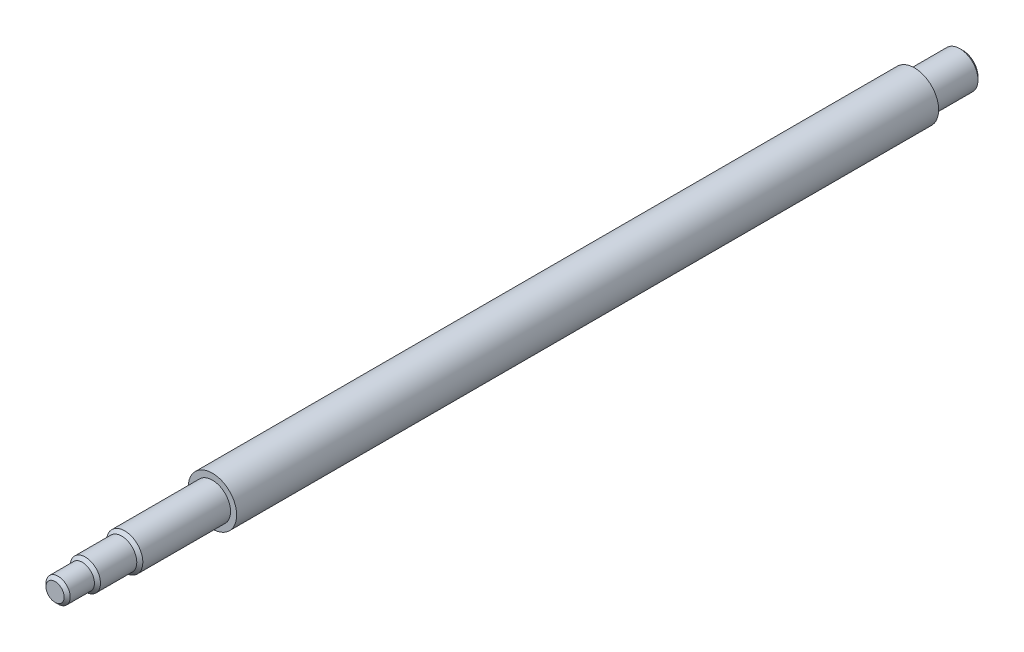
ISO-10303-21;
HEADER;
FILE_DESCRIPTION(('STEP AP214'),'2;1');
FILE_NAME('part.step','',(''),(''),'','','');
FILE_SCHEMA(('AUTOMOTIVE_DESIGN { 1 0 10303 214 1 1 1 1 }'));
ENDSEC;
DATA;
#1=APPLICATION_CONTEXT('core data for automotive mechanical design processes');
#2=APPLICATION_PROTOCOL_DEFINITION('international standard','automotive_design',2000,#1);
#3=PRODUCT_CONTEXT('',#1,'mechanical');
#4=PRODUCT('Part','Part','',(#3));
#5=PRODUCT_RELATED_PRODUCT_CATEGORY('part','',(#4));
#6=PRODUCT_DEFINITION_FORMATION('','',#4);
#7=PRODUCT_DEFINITION_CONTEXT('part definition',#1,'design');
#8=PRODUCT_DEFINITION('design','',#6,#7);
#9=PRODUCT_DEFINITION_SHAPE('','',#8);
#10=(LENGTH_UNIT() NAMED_UNIT(*) SI_UNIT(.MILLI.,.METRE.));
#11=(NAMED_UNIT(*) PLANE_ANGLE_UNIT() SI_UNIT($,.RADIAN.));
#12=(NAMED_UNIT(*) SI_UNIT($,.STERADIAN.) SOLID_ANGLE_UNIT());
#13=UNCERTAINTY_MEASURE_WITH_UNIT(LENGTH_MEASURE(1.E-05),#10,'distance_accuracy_value','');
#14=(GEOMETRIC_REPRESENTATION_CONTEXT(3) GLOBAL_UNCERTAINTY_ASSIGNED_CONTEXT((#13)) GLOBAL_UNIT_ASSIGNED_CONTEXT((#10,
#11,#12)) REPRESENTATION_CONTEXT('',''));
#15=CARTESIAN_POINT('',(0.,0.,0.));
#16=DIRECTION('',(0.,0.,1.));
#17=DIRECTION('',(1.,0.,0.));
#18=AXIS2_PLACEMENT_3D('',#15,#16,#17);
#19=CARTESIAN_POINT('',(0.,4.,0.));
#20=DIRECTION('',(0.,0.,-1.));
#21=DIRECTION('',(-1.,0.,0.));
#22=AXIS2_PLACEMENT_3D('',#19,#20,#21);
#23=PLANE('',#22);
#24=CARTESIAN_POINT('',(0.,0.,0.));
#25=DIRECTION('',(0.,0.,-1.));
#26=DIRECTION('',(-1.,0.,0.));
#27=AXIS2_PLACEMENT_3D('',#24,#25,#26);
#28=CIRCLE('',#27,3.00000000000003);
#29=CARTESIAN_POINT('',(-3.00000000000003,0.,0.));
#30=VERTEX_POINT('',#29);
#31=EDGE_CURVE('E53',#30,#30,#28,.F.);
#32=ORIENTED_EDGE('',*,*,#31,.T.);
#33=EDGE_LOOP('',(#32));
#34=FACE_BOUND('',#33,.T.);
#35=ADVANCED_FACE('F30',(#34),#23,.F.);
#36=CARTESIAN_POINT('',(0.,0.,-300.));
#37=DIRECTION('',(0.,0.,1.));
#38=DIRECTION('',(1.,0.,0.));
#39=AXIS2_PLACEMENT_3D('',#36,#37,#38);
#40=PLANE('',#39);
#41=CARTESIAN_POINT('',(0.,0.,-300.));
#42=DIRECTION('',(0.,0.,1.));
#43=DIRECTION('',(1.,0.,0.));
#44=AXIS2_PLACEMENT_3D('',#41,#42,#43);
#45=CIRCLE('',#44,5.00000000000012);
#46=CARTESIAN_POINT('',(5.00000000000012,0.,-300.));
#47=VERTEX_POINT('',#46);
#48=EDGE_CURVE('E10',#47,#47,#45,.F.);
#49=ORIENTED_EDGE('',*,*,#48,.T.);
#50=EDGE_LOOP('',(#49));
#51=FACE_BOUND('',#50,.T.);
#52=ADVANCED_FACE('F92',(#51),#40,.F.);
#53=CARTESIAN_POINT('',(0.,0.,0.));
#54=DIRECTION('',(0.,0.,1.));
#55=DIRECTION('',(1.,0.,0.));
#56=AXIS2_PLACEMENT_3D('',#53,#54,#55);
#57=CYLINDRICAL_SURFACE('',#56,6.);
#58=CARTESIAN_POINT('',(0.,0.,-299.));
#59=DIRECTION('',(0.,0.,1.));
#60=DIRECTION('',(1.,0.,0.));
#61=AXIS2_PLACEMENT_3D('',#58,#59,#60);
#62=CIRCLE('',#61,6.);
#63=CARTESIAN_POINT('',(6.,0.,-299.));
#64=VERTEX_POINT('',#63);
#65=EDGE_CURVE('E37',#64,#64,#62,.T.);
#66=ORIENTED_EDGE('',*,*,#65,.T.);
#67=EDGE_LOOP('',(#66));
#68=FACE_BOUND('',#67,.T.);
#69=CARTESIAN_POINT('',(0.,0.,-284.));
#70=DIRECTION('',(0.,0.,1.));
#71=DIRECTION('',(1.,0.,0.));
#72=AXIS2_PLACEMENT_3D('',#69,#70,#71);
#73=CIRCLE('',#72,6.);
#74=CARTESIAN_POINT('',(6.,0.,-284.));
#75=VERTEX_POINT('',#74);
#76=EDGE_CURVE('E56',#75,#75,#73,.T.);
#77=ORIENTED_EDGE('',*,*,#76,.F.);
#78=EDGE_LOOP('',(#77));
#79=FACE_BOUND('',#78,.T.);
#80=ADVANCED_FACE('F98',(#68,#79),#57,.T.);
#81=CARTESIAN_POINT('',(0.,6.,-284.));
#82=DIRECTION('',(0.,0.,1.));
#83=DIRECTION('',(1.,0.,0.));
#84=AXIS2_PLACEMENT_3D('',#81,#82,#83);
#85=PLANE('',#84);
#86=CARTESIAN_POINT('',(0.,0.,-284.));
#87=DIRECTION('',(0.,0.,1.));
#88=DIRECTION('',(1.,0.,0.));
#89=AXIS2_PLACEMENT_3D('',#86,#87,#88);
#90=CIRCLE('',#89,8.00000000000001);
#91=CARTESIAN_POINT('',(8.00000000000001,0.,-284.));
#92=VERTEX_POINT('',#91);
#93=EDGE_CURVE('E59',#92,#92,#90,.T.);
#94=ORIENTED_EDGE('',*,*,#93,.F.);
#95=EDGE_LOOP('',(#94));
#96=FACE_BOUND('',#95,.T.);
#97=ORIENTED_EDGE('',*,*,#76,.T.);
#98=EDGE_LOOP('',(#97));
#99=FACE_BOUND('',#98,.T.);
#100=ADVANCED_FACE('F103',(#96,#99),#85,.F.);
#101=CARTESIAN_POINT('',(0.,0.,0.));
#102=DIRECTION('',(0.,0.,1.));
#103=DIRECTION('',(1.,0.,0.));
#104=AXIS2_PLACEMENT_3D('',#101,#102,#103);
#105=CYLINDRICAL_SURFACE('',#104,7.99999999999998);
#106=CARTESIAN_POINT('',(0.,0.,-52.));
#107=DIRECTION('',(0.,0.,1.));
#108=DIRECTION('',(1.,0.,0.));
#109=AXIS2_PLACEMENT_3D('',#106,#107,#108);
#110=CIRCLE('',#109,7.99999999999995);
#111=CARTESIAN_POINT('',(7.99999999999995,0.,-52.));
#112=VERTEX_POINT('',#111);
#113=EDGE_CURVE('E62',#112,#112,#110,.T.);
#114=ORIENTED_EDGE('',*,*,#113,.F.);
#115=EDGE_LOOP('',(#114));
#116=FACE_BOUND('',#115,.T.);
#117=ORIENTED_EDGE('',*,*,#93,.T.);
#118=EDGE_LOOP('',(#117));
#119=FACE_BOUND('',#118,.T.);
#120=ADVANCED_FACE('F106',(#116,#119),#105,.T.);
#121=CARTESIAN_POINT('',(0.,7.99999999999995,-52.));
#122=DIRECTION('',(0.,0.,-1.));
#123=DIRECTION('',(-1.,0.,0.));
#124=AXIS2_PLACEMENT_3D('',#121,#122,#123);
#125=PLANE('',#124);
#126=CARTESIAN_POINT('',(0.,0.,-52.));
#127=DIRECTION('',(0.,0.,1.));
#128=DIRECTION('',(1.,0.,0.));
#129=AXIS2_PLACEMENT_3D('',#126,#127,#128);
#130=CIRCLE('',#129,6.);
#131=CARTESIAN_POINT('',(6.,0.,-52.));
#132=VERTEX_POINT('',#131);
#133=EDGE_CURVE('E65',#132,#132,#130,.T.);
#134=ORIENTED_EDGE('',*,*,#133,.F.);
#135=EDGE_LOOP('',(#134));
#136=FACE_BOUND('',#135,.T.);
#137=ORIENTED_EDGE('',*,*,#113,.T.);
#138=EDGE_LOOP('',(#137));
#139=FACE_BOUND('',#138,.T.);
#140=ADVANCED_FACE('F110',(#136,#139),#125,.F.);
#141=CARTESIAN_POINT('',(0.,0.,0.));
#142=DIRECTION('',(0.,0.,1.));
#143=DIRECTION('',(1.,0.,0.));
#144=AXIS2_PLACEMENT_3D('',#141,#142,#143);
#145=CYLINDRICAL_SURFACE('',#144,6.);
#146=CARTESIAN_POINT('',(0.,0.,-23.));
#147=DIRECTION('',(0.,0.,-1.));
#148=DIRECTION('',(-1.,0.,0.));
#149=AXIS2_PLACEMENT_3D('',#146,#147,#148);
#150=CIRCLE('',#149,6.);
#151=CARTESIAN_POINT('',(-6.,0.,-23.));
#152=VERTEX_POINT('',#151);
#153=EDGE_CURVE('E41',#152,#152,#150,.T.);
#154=ORIENTED_EDGE('',*,*,#153,.T.);
#155=EDGE_LOOP('',(#154));
#156=FACE_BOUND('',#155,.T.);
#157=ORIENTED_EDGE('',*,*,#133,.T.);
#158=EDGE_LOOP('',(#157));
#159=FACE_BOUND('',#158,.T.);
#160=ADVANCED_FACE('F114',(#156,#159),#145,.T.);
#161=CARTESIAN_POINT('',(0.,0.,0.));
#162=DIRECTION('',(0.,0.,1.));
#163=DIRECTION('',(1.,0.,0.));
#164=AXIS2_PLACEMENT_3D('',#161,#162,#163);
#165=CYLINDRICAL_SURFACE('',#164,5.);
#166=CARTESIAN_POINT('',(0.,0.,-10.));
#167=DIRECTION('',(0.,0.,-1.));
#168=DIRECTION('',(-1.,0.,0.));
#169=AXIS2_PLACEMENT_3D('',#166,#167,#168);
#170=CIRCLE('',#169,5.);
#171=CARTESIAN_POINT('',(-5.,0.,-10.));
#172=VERTEX_POINT('',#171);
#173=EDGE_CURVE('E45',#172,#172,#170,.T.);
#174=ORIENTED_EDGE('',*,*,#173,.T.);
#175=EDGE_LOOP('',(#174));
#176=FACE_BOUND('',#175,.T.);
#177=CARTESIAN_POINT('',(0.,0.,-22.));
#178=DIRECTION('',(0.,0.,1.));
#179=DIRECTION('',(1.,0.,0.));
#180=AXIS2_PLACEMENT_3D('',#177,#178,#179);
#181=CIRCLE('',#180,5.);
#182=CARTESIAN_POINT('',(5.,0.,-22.));
#183=VERTEX_POINT('',#182);
#184=EDGE_CURVE('E68',#183,#183,#181,.T.);
#185=ORIENTED_EDGE('',*,*,#184,.T.);
#186=EDGE_LOOP('',(#185));
#187=FACE_BOUND('',#186,.T.);
#188=ADVANCED_FACE('F118',(#176,#187),#165,.T.);
#189=CARTESIAN_POINT('',(0.,0.,0.));
#190=DIRECTION('',(0.,0.,1.));
#191=DIRECTION('',(1.,0.,0.));
#192=AXIS2_PLACEMENT_3D('',#189,#190,#191);
#193=CYLINDRICAL_SURFACE('',#192,4.);
#194=CARTESIAN_POINT('',(0.,0.,-0.999999999999956));
#195=DIRECTION('',(0.,0.,-1.));
#196=DIRECTION('',(-1.,0.,0.));
#197=AXIS2_PLACEMENT_3D('',#194,#195,#196);
#198=CIRCLE('',#197,4.);
#199=CARTESIAN_POINT('',(-4.,0.,-0.999999999999956));
#200=VERTEX_POINT('',#199);
#201=EDGE_CURVE('E50',#200,#200,#198,.T.);
#202=ORIENTED_EDGE('',*,*,#201,.T.);
#203=EDGE_LOOP('',(#202));
#204=FACE_BOUND('',#203,.T.);
#205=CARTESIAN_POINT('',(0.,0.,-9.));
#206=DIRECTION('',(0.,0.,1.));
#207=DIRECTION('',(1.,0.,0.));
#208=AXIS2_PLACEMENT_3D('',#205,#206,#207);
#209=CIRCLE('',#208,4.);
#210=CARTESIAN_POINT('',(4.,0.,-9.));
#211=VERTEX_POINT('',#210);
#212=EDGE_CURVE('E71',#211,#211,#209,.T.);
#213=ORIENTED_EDGE('',*,*,#212,.T.);
#214=EDGE_LOOP('',(#213));
#215=FACE_BOUND('',#214,.T.);
#216=ADVANCED_FACE('F75',(#204,#215),#193,.T.);
#217=CARTESIAN_POINT('',(0.,0.,0.));
#218=DIRECTION('',(0.,0.,-1.));
#219=DIRECTION('',(-1.,0.,0.));
#220=AXIS2_PLACEMENT_3D('',#217,#218,#219);
#221=CONICAL_SURFACE('',#220,3.00000000000003,0.785398163397455);
#222=ORIENTED_EDGE('',*,*,#201,.F.);
#223=EDGE_LOOP('',(#222));
#224=FACE_BOUND('',#223,.T.);
#225=ORIENTED_EDGE('',*,*,#31,.F.);
#226=EDGE_LOOP('',(#225));
#227=FACE_BOUND('',#226,.T.);
#228=ADVANCED_FACE('F80',(#224,#227),#221,.T.);
#229=CARTESIAN_POINT('',(0.,0.,-9.));
#230=DIRECTION('',(0.,0.,-1.));
#231=DIRECTION('',(-1.,0.,0.));
#232=AXIS2_PLACEMENT_3D('',#229,#230,#231);
#233=CONICAL_SURFACE('',#232,3.99999999999998,0.785398163397454);
#234=ORIENTED_EDGE('',*,*,#173,.F.);
#235=EDGE_LOOP('',(#234));
#236=FACE_BOUND('',#235,.T.);
#237=ORIENTED_EDGE('',*,*,#212,.F.);
#238=EDGE_LOOP('',(#237));
#239=FACE_BOUND('',#238,.T.);
#240=ADVANCED_FACE('F77',(#236,#239),#233,.T.);
#241=CARTESIAN_POINT('',(0.,0.,-22.));
#242=DIRECTION('',(0.,0.,-1.));
#243=DIRECTION('',(-1.,0.,0.));
#244=AXIS2_PLACEMENT_3D('',#241,#242,#243);
#245=CONICAL_SURFACE('',#244,4.99999999999998,0.785398163397452);
#246=ORIENTED_EDGE('',*,*,#153,.F.);
#247=EDGE_LOOP('',(#246));
#248=FACE_BOUND('',#247,.T.);
#249=ORIENTED_EDGE('',*,*,#184,.F.);
#250=EDGE_LOOP('',(#249));
#251=FACE_BOUND('',#250,.T.);
#252=ADVANCED_FACE('F79',(#248,#251),#245,.T.);
#253=CARTESIAN_POINT('',(0.,0.,-299.));
#254=DIRECTION('',(0.,0.,1.));
#255=DIRECTION('',(1.,0.,0.));
#256=AXIS2_PLACEMENT_3D('',#253,#254,#255);
#257=CONICAL_SURFACE('',#256,6.,0.785398163397445);
#258=ORIENTED_EDGE('',*,*,#48,.F.);
#259=EDGE_LOOP('',(#258));
#260=FACE_BOUND('',#259,.T.);
#261=ORIENTED_EDGE('',*,*,#65,.F.);
#262=EDGE_LOOP('',(#261));
#263=FACE_BOUND('',#262,.T.);
#264=ADVANCED_FACE('F32',(#260,#263),#257,.T.);
#265=CLOSED_SHELL('',(#35,#52,#80,#100,#120,#140,#160,#188,#216,#228,#240,#252,#264));
#266=MANIFOLD_SOLID_BREP('B2',#265);
#267=ADVANCED_BREP_SHAPE_REPRESENTATION('',(#18,#266),#14);
#268=SHAPE_DEFINITION_REPRESENTATION(#9,#267);
ENDSEC;
END-ISO-10303-21;
